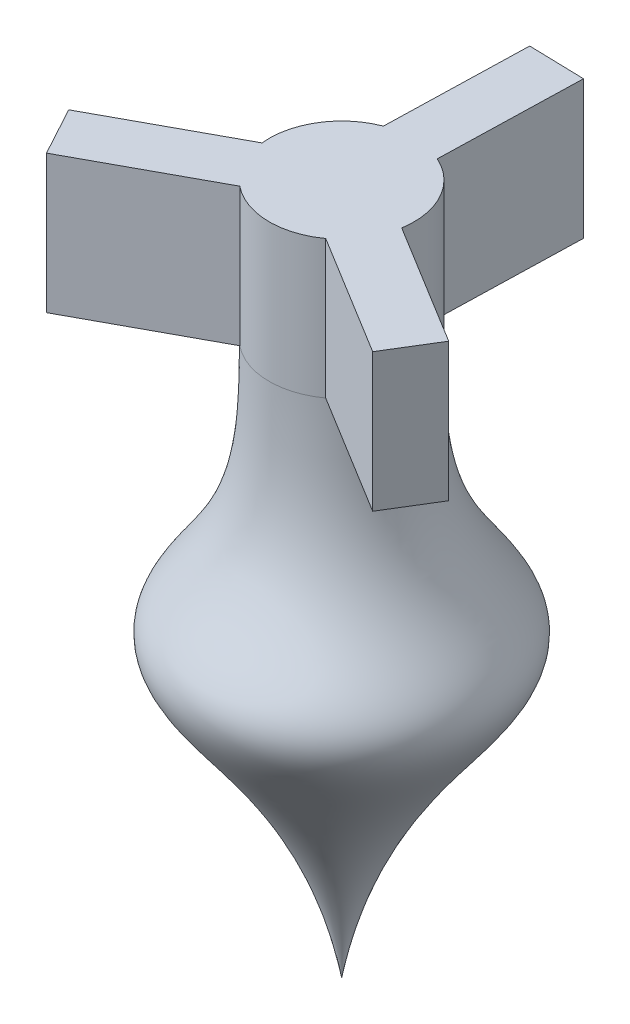
ISO-10303-21;
HEADER;
FILE_DESCRIPTION(('STEP AP214'),'2;1');
FILE_NAME('part.step','',(''),(''),'','','');
FILE_SCHEMA(('AUTOMOTIVE_DESIGN { 1 0 10303 214 1 1 1 1 }'));
ENDSEC;
DATA;
#1=APPLICATION_CONTEXT('core data for automotive mechanical design processes');
#2=APPLICATION_PROTOCOL_DEFINITION('international standard','automotive_design',2000,#1);
#3=PRODUCT_CONTEXT('',#1,'mechanical');
#4=PRODUCT('Part','Part','',(#3));
#5=PRODUCT_RELATED_PRODUCT_CATEGORY('part','',(#4));
#6=PRODUCT_DEFINITION_FORMATION('','',#4);
#7=PRODUCT_DEFINITION_CONTEXT('part definition',#1,'design');
#8=PRODUCT_DEFINITION('design','',#6,#7);
#9=PRODUCT_DEFINITION_SHAPE('','',#8);
#10=(LENGTH_UNIT() NAMED_UNIT(*) SI_UNIT(.MILLI.,.METRE.));
#11=(NAMED_UNIT(*) PLANE_ANGLE_UNIT() SI_UNIT($,.RADIAN.));
#12=(NAMED_UNIT(*) SI_UNIT($,.STERADIAN.) SOLID_ANGLE_UNIT());
#13=UNCERTAINTY_MEASURE_WITH_UNIT(LENGTH_MEASURE(1.E-05),#10,'distance_accuracy_value','');
#14=(GEOMETRIC_REPRESENTATION_CONTEXT(3) GLOBAL_UNCERTAINTY_ASSIGNED_CONTEXT((#13)) GLOBAL_UNIT_ASSIGNED_CONTEXT((#10,
#11,#12)) REPRESENTATION_CONTEXT('',''));
#15=CARTESIAN_POINT('',(0.,0.,0.));
#16=DIRECTION('',(0.,0.,1.));
#17=DIRECTION('',(1.,0.,0.));
#18=AXIS2_PLACEMENT_3D('',#15,#16,#17);
#19=CARTESIAN_POINT('',(0.,16.8298057249515,0.));
#20=DIRECTION('',(0.,-1.,0.));
#21=DIRECTION('',(0.,0.,-1.));
#22=AXIS2_PLACEMENT_3D('',#19,#20,#21);
#23=CYLINDRICAL_SURFACE('',#22,13.0970940867519);
#24=CARTESIAN_POINT('',(0.,41.8298057249515,0.));
#25=DIRECTION('',(0.,-1.,0.));
#26=DIRECTION('',(0.,0.,-1.));
#27=AXIS2_PLACEMENT_3D('',#24,#25,#26);
#28=CIRCLE('',#27,13.0970940867519);
#29=CARTESIAN_POINT('',(5.31910648056195,41.8298057249515,-11.9683323719587));
#30=VERTEX_POINT('',#29);
#31=CARTESIAN_POINT('',(12.9331221328938,41.8298057249515,2.06596839590619));
#32=VERTEX_POINT('',#31);
#33=EDGE_CURVE('E11',#30,#32,#28,.T.);
#34=ORIENTED_EDGE('',*,*,#33,.T.);
#35=DIRECTION('',(0.,-1.,0.));
#36=VECTOR('',#35,1.);
#37=CARTESIAN_POINT('',(12.9331221328938,41.8298057249515,2.06596839590619));
#38=LINE('',#37,#36);
#39=CARTESIAN_POINT('',(12.9331221328938,16.8298057249515,2.06596839590619));
#40=VERTEX_POINT('',#39);
#41=EDGE_CURVE('E74',#32,#40,#38,.T.);
#42=ORIENTED_EDGE('',*,*,#41,.T.);
#43=CARTESIAN_POINT('',(0.,16.8298057249515,0.));
#44=DIRECTION('',(0.,-1.,0.));
#45=DIRECTION('',(0.,0.,-1.));
#46=AXIS2_PLACEMENT_3D('',#43,#44,#45);
#47=CIRCLE('',#46,13.0970940867519);
#48=CARTESIAN_POINT('',(5.31910648056195,16.8298057249515,-11.9683323719587));
#49=VERTEX_POINT('',#48);
#50=EDGE_CURVE('E269',#49,#40,#47,.T.);
#51=ORIENTED_EDGE('',*,*,#50,.F.);
#52=DIRECTION('',(0.,-1.,0.));
#53=VECTOR('',#52,1.);
#54=CARTESIAN_POINT('',(5.31910648056195,41.8298057249515,-11.9683323719587));
#55=LINE('',#54,#53);
#56=EDGE_CURVE('E254',#30,#49,#55,.T.);
#57=ORIENTED_EDGE('',*,*,#56,.F.);
#58=EDGE_LOOP('',(#34,#42,#51,#57));
#59=FACE_BOUND('',#58,.T.);
#60=ADVANCED_FACE('F49',(#59),#23,.T.);
#61=CARTESIAN_POINT('',(7.70532663477087,16.8298057249515,10.5906475235805));
#62=VERTEX_POINT('',#61);
#63=CARTESIAN_POINT('',(-8.25574218071735,16.8298057249515,10.1674281193798));
#64=VERTEX_POINT('',#63);
#65=EDGE_CURVE('E67',#62,#64,#47,.T.);
#66=ORIENTED_EDGE('',*,*,#65,.F.);
#67=DIRECTION('',(0.,-1.,0.));
#68=VECTOR('',#67,1.);
#69=CARTESIAN_POINT('',(7.70532663477087,41.8298057249515,10.5906475235805));
#70=LINE('',#69,#68);
#71=CARTESIAN_POINT('',(7.70532663477087,41.8298057249515,10.5906475235805));
#72=VERTEX_POINT('',#71);
#73=EDGE_CURVE('E303',#72,#62,#70,.T.);
#74=ORIENTED_EDGE('',*,*,#73,.F.);
#75=CARTESIAN_POINT('',(-8.25574218071734,41.8298057249515,10.1674281193798));
#76=VERTEX_POINT('',#75);
#77=EDGE_CURVE('E59',#72,#76,#28,.T.);
#78=ORIENTED_EDGE('',*,*,#77,.T.);
#79=DIRECTION('',(0.,-1.,0.));
#80=VECTOR('',#79,1.);
#81=CARTESIAN_POINT('',(-8.25574218071734,41.8298057249515,10.1674281193798));
#82=LINE('',#81,#80);
#83=EDGE_CURVE('E173',#76,#64,#82,.T.);
#84=ORIENTED_EDGE('',*,*,#83,.T.);
#85=EDGE_LOOP('',(#66,#74,#78,#84));
#86=FACE_BOUND('',#85,.T.);
#87=ADVANCED_FACE('F314',(#86),#23,.T.);
#88=CARTESIAN_POINT('',(-13.0244331153329,16.8298057249515,1.37768484837832));
#89=VERTEX_POINT('',#88);
#90=CARTESIAN_POINT('',(-4.67737995217641,16.8298057249515,-12.2333965152859));
#91=VERTEX_POINT('',#90);
#92=EDGE_CURVE('E265',#89,#91,#47,.T.);
#93=ORIENTED_EDGE('',*,*,#92,.F.);
#94=DIRECTION('',(0.,-1.,0.));
#95=VECTOR('',#94,1.);
#96=CARTESIAN_POINT('',(-13.0244331153329,41.8298057249515,1.37768484837832));
#97=LINE('',#96,#95);
#98=CARTESIAN_POINT('',(-13.0244331153329,41.8298057249515,1.37768484837832));
#99=VERTEX_POINT('',#98);
#100=EDGE_CURVE('E177',#99,#89,#97,.T.);
#101=ORIENTED_EDGE('',*,*,#100,.F.);
#102=CARTESIAN_POINT('',(-4.67737995217641,41.8298057249515,-12.2333965152859));
#103=VERTEX_POINT('',#102);
#104=EDGE_CURVE('E60',#99,#103,#28,.T.);
#105=ORIENTED_EDGE('',*,*,#104,.T.);
#106=DIRECTION('',(0.,-1.,0.));
#107=VECTOR('',#106,1.);
#108=CARTESIAN_POINT('',(-4.67737995217641,41.8298057249515,-12.2333965152859));
#109=LINE('',#108,#107);
#110=EDGE_CURVE('E258',#103,#91,#109,.T.);
#111=ORIENTED_EDGE('',*,*,#110,.T.);
#112=EDGE_LOOP('',(#93,#101,#105,#111));
#113=FACE_BOUND('',#112,.T.);
#114=ADVANCED_FACE('F290',(#113),#23,.T.);
#115=CARTESIAN_POINT('',(0.,-83.1701942750485,0.));
#116=CARTESIAN_POINT('',(-9.19623318599994,-29.3835447194182,0.));
#117=CARTESIAN_POINT('',(-56.3121040622363,-30.1178180317751,0.));
#118=CARTESIAN_POINT('',(-14.4585252578913,-24.733147074491,0.));
#119=CARTESIAN_POINT('',(-13.0970940867519,-14.0081970464951,0.));
#120=CARTESIAN_POINT('',(-13.0970940867519,16.8298057249515,0.));
#121=B_SPLINE_CURVE_WITH_KNOTS('',5,(#115,#116,#117,#118,#119,#120),.UNSPECIFIED.,.F.,.F.,(6,6),
(0.,1.),.UNSPECIFIED.);
#122=CARTESIAN_POINT('',(0.,16.8298057249515,0.));
#123=DIRECTION('',(0.,-1.,0.));
#124=AXIS1_PLACEMENT('',#122,#123);
#125=SURFACE_OF_REVOLUTION('',#121,#124);
#126=ORIENTED_EDGE('',*,*,#50,.T.);
#127=CARTESIAN_POINT('',(0.,16.8298057249515,0.));
#128=DIRECTION('',(0.,-1.,0.));
#129=DIRECTION('',(0.,0.,1.));
#130=AXIS2_PLACEMENT_3D('',#127,#128,#129);
#131=CIRCLE('',#130,13.0970940867519);
#132=EDGE_CURVE('E171',#40,#62,#131,.T.);
#133=ORIENTED_EDGE('',*,*,#132,.T.);
#134=ORIENTED_EDGE('',*,*,#65,.T.);
#135=CARTESIAN_POINT('',(0.,16.8298057249515,0.));
#136=DIRECTION('',(0.,-1.,0.));
#137=DIRECTION('',(0.,0.,1.));
#138=AXIS2_PLACEMENT_3D('',#135,#136,#137);
#139=CIRCLE('',#138,13.0970940867519);
#140=EDGE_CURVE('E208',#64,#89,#139,.T.);
#141=ORIENTED_EDGE('',*,*,#140,.T.);
#142=ORIENTED_EDGE('',*,*,#92,.T.);
#143=CARTESIAN_POINT('',(0.,16.8298057249515,0.));
#144=DIRECTION('',(0.,-1.,0.));
#145=DIRECTION('',(0.,0.,1.));
#146=AXIS2_PLACEMENT_3D('',#143,#144,#145);
#147=CIRCLE('',#146,13.0970940867519);
#148=EDGE_CURVE('E245',#91,#49,#147,.T.);
#149=ORIENTED_EDGE('',*,*,#148,.T.);
#150=EDGE_LOOP('',(#126,#133,#134,#141,#142,#149));
#151=FACE_BOUND('',#150,.T.);
#152=CARTESIAN_POINT('',(0.,-83.1701942750485,0.));
#153=VERTEX_POINT('',#152);
#154=VERTEX_LOOP('',#153);
#155=FACE_BOUND('',#154,.T.);
#156=ADVANCED_FACE('F51',(#151,#155),#125,.F.);
#157=CARTESIAN_POINT('',(0.,41.8298057249515,0.));
#158=DIRECTION('',(0.,1.,0.));
#159=DIRECTION('',(0.,0.,1.));
#160=AXIS2_PLACEMENT_3D('',#157,#158,#159);
#161=PLANE('',#160);
#162=ORIENTED_EDGE('',*,*,#33,.F.);
#163=DIRECTION('',(0.0265064143327188,0.,-0.999648643273837));
#164=VECTOR('',#163,1.);
#165=CARTESIAN_POINT('',(6.00272687611384,41.8298057249515,-37.7500240164686));
#166=LINE('',#165,#164);
#167=CARTESIAN_POINT('',(6.00272687611384,41.8298057249515,-37.7500240164686));
#168=VERTEX_POINT('',#167);
#169=EDGE_CURVE('E234',#30,#168,#166,.T.);
#170=ORIENTED_EDGE('',*,*,#169,.T.);
#171=DIRECTION('',(-0.999648643273837,0.,-0.0265064143327186));
#172=VECTOR('',#171,1.);
#173=CARTESIAN_POINT('',(6.00272687611384,41.8298057249515,-37.7500240164686));
#174=LINE('',#173,#172);
#175=CARTESIAN_POINT('',(-3.99375955662452,41.8298057249515,-38.0150881597958));
#176=VERTEX_POINT('',#175);
#177=EDGE_CURVE('E225',#168,#176,#174,.T.);
#178=ORIENTED_EDGE('',*,*,#177,.T.);
#179=DIRECTION('',(-0.0265064143327189,0.,0.999648643273837));
#180=VECTOR('',#179,1.);
#181=CARTESIAN_POINT('',(-3.99375955662452,41.8298057249515,-38.0150881597958));
#182=LINE('',#181,#180);
#183=EDGE_CURVE('E229',#176,#103,#182,.T.);
#184=ORIENTED_EDGE('',*,*,#183,.T.);
#185=ORIENTED_EDGE('',*,*,#104,.F.);
#186=DIRECTION('',(-0.878974327100148,0.,0.476869093461552));
#187=VECTOR('',#186,1.);
#188=CARTESIAN_POINT('',(-35.6938432297913,41.8298057249515,13.6764980415403));
#189=LINE('',#188,#187);
#190=CARTESIAN_POINT('',(-35.6938432297913,41.8298057249515,13.6764980415403));
#191=VERTEX_POINT('',#190);
#192=EDGE_CURVE('E219',#99,#191,#189,.T.);
#193=ORIENTED_EDGE('',*,*,#192,.T.);
#194=DIRECTION('',(0.476869093461552,0.,0.878974327100148));
#195=VECTOR('',#194,1.);
#196=CARTESIAN_POINT('',(-30.9251522951758,41.8298057249515,22.4662413125417));
#197=LINE('',#196,#195);
#198=CARTESIAN_POINT('',(-30.9251522951758,41.8298057249515,22.4662413125417));
#199=VERTEX_POINT('',#198);
#200=EDGE_CURVE('E200',#191,#199,#197,.T.);
#201=ORIENTED_EDGE('',*,*,#200,.T.);
#202=DIRECTION('',(0.878974327100148,0.,-0.476869093461552));
#203=VECTOR('',#202,1.);
#204=CARTESIAN_POINT('',(-30.9251522951758,41.8298057249515,22.4662413125417));
#205=LINE('',#204,#203);
#206=EDGE_CURVE('E205',#199,#76,#205,.T.);
#207=ORIENTED_EDGE('',*,*,#206,.T.);
#208=ORIENTED_EDGE('',*,*,#77,.F.);
#209=DIRECTION('',(0.852467912767429,0.,0.522779549812293));
#210=VECTOR('',#209,1.);
#211=CARTESIAN_POINT('',(29.6911163536774,41.8298057249515,24.0735259749286));
#212=LINE('',#211,#210);
#213=CARTESIAN_POINT('',(29.6911163536774,41.8298057249515,24.0735259749286));
#214=VERTEX_POINT('',#213);
#215=EDGE_CURVE('E184',#72,#214,#212,.T.);
#216=ORIENTED_EDGE('',*,*,#215,.T.);
#217=DIRECTION('',(0.522779549812293,0.,-0.852467912767429));
#218=VECTOR('',#217,1.);
#219=CARTESIAN_POINT('',(29.6911163536774,41.8298057249515,24.0735259749286));
#220=LINE('',#219,#218);
#221=CARTESIAN_POINT('',(34.9189118518004,41.8298057249515,15.5488468472543));
#222=VERTEX_POINT('',#221);
#223=EDGE_CURVE('E167',#214,#222,#220,.T.);
#224=ORIENTED_EDGE('',*,*,#223,.T.);
#225=DIRECTION('',(-0.852467912767429,0.,-0.522779549812293));
#226=VECTOR('',#225,1.);
#227=CARTESIAN_POINT('',(34.9189118518004,41.8298057249515,15.5488468472543));
#228=LINE('',#227,#226);
#229=EDGE_CURVE('E159',#222,#32,#228,.T.);
#230=ORIENTED_EDGE('',*,*,#229,.T.);
#231=EDGE_LOOP('',(#162,#170,#178,#184,#185,#193,#201,#207,#208,#216,#224,#230));
#232=FACE_BOUND('',#231,.T.);
#233=ADVANCED_FACE('F294',(#232),#161,.T.);
#234=CARTESIAN_POINT('',(6.00272687611384,41.8298057249515,-37.7500240164686));
#235=DIRECTION('',(-0.0265064143327186,0.,0.999648643273837));
#236=DIRECTION('',(0.999648643273837,0.,0.0265064143327186));
#237=AXIS2_PLACEMENT_3D('',#234,#235,#236);
#238=PLANE('',#237);
#239=DIRECTION('',(-0.999648643273837,0.,-0.0265064143327186));
#240=VECTOR('',#239,1.);
#241=CARTESIAN_POINT('',(6.00272687611384,16.8298057249515,-37.7500240164686));
#242=LINE('',#241,#240);
#243=CARTESIAN_POINT('',(6.00272687611384,16.8298057249515,-37.7500240164686));
#244=VERTEX_POINT('',#243);
#245=CARTESIAN_POINT('',(-3.99375955662452,16.8298057249515,-38.0150881597958));
#246=VERTEX_POINT('',#245);
#247=EDGE_CURVE('E216',#244,#246,#242,.T.);
#248=ORIENTED_EDGE('',*,*,#247,.T.);
#249=DIRECTION('',(0.,-1.,0.));
#250=VECTOR('',#249,1.);
#251=CARTESIAN_POINT('',(-3.99375955662452,41.8298057249515,-38.0150881597958));
#252=LINE('',#251,#250);
#253=EDGE_CURVE('E262',#176,#246,#252,.T.);
#254=ORIENTED_EDGE('',*,*,#253,.F.);
#255=ORIENTED_EDGE('',*,*,#177,.F.);
#256=DIRECTION('',(0.,-1.,0.));
#257=VECTOR('',#256,1.);
#258=CARTESIAN_POINT('',(6.00272687611384,41.8298057249515,-37.7500240164686));
#259=LINE('',#258,#257);
#260=EDGE_CURVE('E237',#168,#244,#259,.T.);
#261=ORIENTED_EDGE('',*,*,#260,.T.);
#262=EDGE_LOOP('',(#248,#254,#255,#261));
#263=FACE_BOUND('',#262,.T.);
#264=ADVANCED_FACE('F298',(#263),#238,.F.);
#265=CARTESIAN_POINT('',(-3.99375955662452,41.8298057249515,-38.0150881597958));
#266=DIRECTION('',(0.999648643273837,0.,0.0265064143327189));
#267=DIRECTION('',(0.0265064143327189,0.,-0.999648643273837));
#268=AXIS2_PLACEMENT_3D('',#265,#266,#267);
#269=PLANE('',#268);
#270=DIRECTION('',(-0.0265064143327189,0.,0.999648643273837));
#271=VECTOR('',#270,1.);
#272=CARTESIAN_POINT('',(-3.99375955662452,16.8298057249515,-38.0150881597958));
#273=LINE('',#272,#271);
#274=EDGE_CURVE('E241',#246,#91,#273,.T.);
#275=ORIENTED_EDGE('',*,*,#274,.T.);
#276=ORIENTED_EDGE('',*,*,#110,.F.);
#277=ORIENTED_EDGE('',*,*,#183,.F.);
#278=ORIENTED_EDGE('',*,*,#253,.T.);
#279=EDGE_LOOP('',(#275,#276,#277,#278));
#280=FACE_BOUND('',#279,.T.);
#281=ADVANCED_FACE('F285',(#280),#269,.F.);
#282=CARTESIAN_POINT('',(6.00272687611384,41.8298057249515,-37.7500240164686));
#283=DIRECTION('',(-0.999648643273837,0.,-0.0265064143327188));
#284=DIRECTION('',(-0.0265064143327188,0.,0.999648643273837));
#285=AXIS2_PLACEMENT_3D('',#282,#283,#284);
#286=PLANE('',#285);
#287=DIRECTION('',(0.0265064143327188,0.,-0.999648643273837));
#288=VECTOR('',#287,1.);
#289=CARTESIAN_POINT('',(6.00272687611384,16.8298057249515,-37.7500240164686));
#290=LINE('',#289,#288);
#291=EDGE_CURVE('E230',#49,#244,#290,.T.);
#292=ORIENTED_EDGE('',*,*,#291,.T.);
#293=ORIENTED_EDGE('',*,*,#260,.F.);
#294=ORIENTED_EDGE('',*,*,#169,.F.);
#295=ORIENTED_EDGE('',*,*,#56,.T.);
#296=EDGE_LOOP('',(#292,#293,#294,#295));
#297=FACE_BOUND('',#296,.T.);
#298=ADVANCED_FACE('F300',(#297),#286,.F.);
#299=CARTESIAN_POINT('',(0.,16.8298057249515,0.));
#300=DIRECTION('',(0.,1.,0.));
#301=DIRECTION('',(0.,0.,1.));
#302=AXIS2_PLACEMENT_3D('',#299,#300,#301);
#303=PLANE('',#302);
#304=ORIENTED_EDGE('',*,*,#247,.F.);
#305=ORIENTED_EDGE('',*,*,#291,.F.);
#306=ORIENTED_EDGE('',*,*,#148,.F.);
#307=ORIENTED_EDGE('',*,*,#274,.F.);
#308=EDGE_LOOP('',(#304,#305,#306,#307));
#309=FACE_BOUND('',#308,.T.);
#310=ADVANCED_FACE('F289',(#309),#303,.F.);
#311=CARTESIAN_POINT('',(-30.9251522951758,41.8298057249515,22.4662413125417));
#312=DIRECTION('',(-0.476869093461552,0.,-0.878974327100148));
#313=DIRECTION('',(-0.878974327100148,0.,0.476869093461552));
#314=AXIS2_PLACEMENT_3D('',#311,#312,#313);
#315=PLANE('',#314);
#316=DIRECTION('',(0.878974327100148,0.,-0.476869093461552));
#317=VECTOR('',#316,1.);
#318=CARTESIAN_POINT('',(-30.9251522951758,16.8298057249515,22.4662413125417));
#319=LINE('',#318,#317);
#320=CARTESIAN_POINT('',(-30.9251522951758,16.8298057249515,22.4662413125417));
#321=VERTEX_POINT('',#320);
#322=EDGE_CURVE('E212',#321,#64,#319,.T.);
#323=ORIENTED_EDGE('',*,*,#322,.T.);
#324=ORIENTED_EDGE('',*,*,#83,.F.);
#325=ORIENTED_EDGE('',*,*,#206,.F.);
#326=DIRECTION('',(0.,-1.,0.));
#327=VECTOR('',#326,1.);
#328=CARTESIAN_POINT('',(-30.9251522951758,41.8298057249515,22.4662413125417));
#329=LINE('',#328,#327);
#330=EDGE_CURVE('E196',#199,#321,#329,.T.);
#331=ORIENTED_EDGE('',*,*,#330,.T.);
#332=EDGE_LOOP('',(#323,#324,#325,#331));
#333=FACE_BOUND('',#332,.T.);
#334=ADVANCED_FACE('F321',(#333),#315,.F.);
#335=CARTESIAN_POINT('',(-35.6938432297913,41.8298057249515,13.6764980415403));
#336=DIRECTION('',(0.476869093461552,0.,0.878974327100148));
#337=DIRECTION('',(0.878974327100148,0.,-0.476869093461552));
#338=AXIS2_PLACEMENT_3D('',#335,#336,#337);
#339=PLANE('',#338);
#340=DIRECTION('',(-0.878974327100148,0.,0.476869093461552));
#341=VECTOR('',#340,1.);
#342=CARTESIAN_POINT('',(-35.6938432297913,16.8298057249515,13.6764980415403));
#343=LINE('',#342,#341);
#344=CARTESIAN_POINT('',(-35.6938432297913,16.8298057249515,13.6764980415403));
#345=VERTEX_POINT('',#344);
#346=EDGE_CURVE('E204',#89,#345,#343,.T.);
#347=ORIENTED_EDGE('',*,*,#346,.T.);
#348=DIRECTION('',(0.,-1.,0.));
#349=VECTOR('',#348,1.);
#350=CARTESIAN_POINT('',(-35.6938432297913,41.8298057249515,13.6764980415403));
#351=LINE('',#350,#349);
#352=EDGE_CURVE('E192',#191,#345,#351,.T.);
#353=ORIENTED_EDGE('',*,*,#352,.F.);
#354=ORIENTED_EDGE('',*,*,#192,.F.);
#355=ORIENTED_EDGE('',*,*,#100,.T.);
#356=EDGE_LOOP('',(#347,#353,#354,#355));
#357=FACE_BOUND('',#356,.T.);
#358=ADVANCED_FACE('F329',(#357),#339,.F.);
#359=CARTESIAN_POINT('',(-30.9251522951758,41.8298057249515,22.4662413125417));
#360=DIRECTION('',(0.878974327100148,0.,-0.476869093461552));
#361=DIRECTION('',(-0.476869093461552,0.,-0.878974327100148));
#362=AXIS2_PLACEMENT_3D('',#359,#360,#361);
#363=PLANE('',#362);
#364=DIRECTION('',(0.476869093461552,0.,0.878974327100148));
#365=VECTOR('',#364,1.);
#366=CARTESIAN_POINT('',(-30.9251522951758,16.8298057249515,22.4662413125417));
#367=LINE('',#366,#365);
#368=EDGE_CURVE('E201',#345,#321,#367,.T.);
#369=ORIENTED_EDGE('',*,*,#368,.T.);
#370=ORIENTED_EDGE('',*,*,#330,.F.);
#371=ORIENTED_EDGE('',*,*,#200,.F.);
#372=ORIENTED_EDGE('',*,*,#352,.T.);
#373=EDGE_LOOP('',(#369,#370,#371,#372));
#374=FACE_BOUND('',#373,.T.);
#375=ADVANCED_FACE('F331',(#374),#363,.F.);
#376=CARTESIAN_POINT('',(0.,16.8298057249515,0.));
#377=DIRECTION('',(0.,1.,0.));
#378=DIRECTION('',(0.,0.,1.));
#379=AXIS2_PLACEMENT_3D('',#376,#377,#378);
#380=PLANE('',#379);
#381=ORIENTED_EDGE('',*,*,#322,.F.);
#382=ORIENTED_EDGE('',*,*,#368,.F.);
#383=ORIENTED_EDGE('',*,*,#346,.F.);
#384=ORIENTED_EDGE('',*,*,#140,.F.);
#385=EDGE_LOOP('',(#381,#382,#383,#384));
#386=FACE_BOUND('',#385,.T.);
#387=ADVANCED_FACE('F325',(#386),#380,.F.);
#388=CARTESIAN_POINT('',(34.9189118518004,41.8298057249515,15.5488468472543));
#389=DIRECTION('',(-0.522779549812293,0.,0.852467912767429));
#390=DIRECTION('',(0.852467912767429,0.,0.522779549812293));
#391=AXIS2_PLACEMENT_3D('',#388,#389,#390);
#392=PLANE('',#391);
#393=DIRECTION('',(-0.852467912767429,0.,-0.522779549812293));
#394=VECTOR('',#393,1.);
#395=CARTESIAN_POINT('',(34.9189118518004,16.8298057249515,15.5488468472543));
#396=LINE('',#395,#394);
#397=CARTESIAN_POINT('',(34.9189118518004,16.8298057249515,15.5488468472543));
#398=VERTEX_POINT('',#397);
#399=EDGE_CURVE('E164',#398,#40,#396,.T.);
#400=ORIENTED_EDGE('',*,*,#399,.T.);
#401=ORIENTED_EDGE('',*,*,#41,.F.);
#402=ORIENTED_EDGE('',*,*,#229,.F.);
#403=DIRECTION('',(0.,-1.,0.));
#404=VECTOR('',#403,1.);
#405=CARTESIAN_POINT('',(34.9189118518004,41.8298057249515,15.5488468472543));
#406=LINE('',#405,#404);
#407=EDGE_CURVE('E150',#222,#398,#406,.T.);
#408=ORIENTED_EDGE('',*,*,#407,.T.);
#409=EDGE_LOOP('',(#400,#401,#402,#408));
#410=FACE_BOUND('',#409,.T.);
#411=ADVANCED_FACE('F163',(#410),#392,.F.);
#412=CARTESIAN_POINT('',(29.6911163536774,41.8298057249515,24.0735259749286));
#413=DIRECTION('',(0.522779549812293,0.,-0.852467912767429));
#414=DIRECTION('',(-0.852467912767429,0.,-0.522779549812293));
#415=AXIS2_PLACEMENT_3D('',#412,#413,#414);
#416=PLANE('',#415);
#417=DIRECTION('',(0.852467912767429,0.,0.522779549812293));
#418=VECTOR('',#417,1.);
#419=CARTESIAN_POINT('',(29.6911163536774,16.8298057249515,24.0735259749286));
#420=LINE('',#419,#418);
#421=CARTESIAN_POINT('',(29.6911163536774,16.8298057249515,24.0735259749286));
#422=VERTEX_POINT('',#421);
#423=EDGE_CURVE('E158',#62,#422,#420,.T.);
#424=ORIENTED_EDGE('',*,*,#423,.T.);
#425=DIRECTION('',(0.,-1.,0.));
#426=VECTOR('',#425,1.);
#427=CARTESIAN_POINT('',(29.6911163536774,41.8298057249515,24.0735259749286));
#428=LINE('',#427,#426);
#429=EDGE_CURVE('E153',#214,#422,#428,.T.);
#430=ORIENTED_EDGE('',*,*,#429,.F.);
#431=ORIENTED_EDGE('',*,*,#215,.F.);
#432=ORIENTED_EDGE('',*,*,#73,.T.);
#433=EDGE_LOOP('',(#424,#430,#431,#432));
#434=FACE_BOUND('',#433,.T.);
#435=ADVANCED_FACE('F312',(#434),#416,.F.);
#436=CARTESIAN_POINT('',(29.6911163536774,41.8298057249515,24.0735259749286));
#437=DIRECTION('',(-0.852467912767429,0.,-0.522779549812293));
#438=DIRECTION('',(-0.522779549812293,0.,0.852467912767429));
#439=AXIS2_PLACEMENT_3D('',#436,#437,#438);
#440=PLANE('',#439);
#441=DIRECTION('',(0.522779549812293,0.,-0.852467912767429));
#442=VECTOR('',#441,1.);
#443=CARTESIAN_POINT('',(29.6911163536774,16.8298057249515,24.0735259749286));
#444=LINE('',#443,#442);
#445=EDGE_CURVE('E146',#422,#398,#444,.T.);
#446=ORIENTED_EDGE('',*,*,#445,.T.);
#447=ORIENTED_EDGE('',*,*,#407,.F.);
#448=ORIENTED_EDGE('',*,*,#223,.F.);
#449=ORIENTED_EDGE('',*,*,#429,.T.);
#450=EDGE_LOOP('',(#446,#447,#448,#449));
#451=FACE_BOUND('',#450,.T.);
#452=ADVANCED_FACE('F148',(#451),#440,.F.);
#453=CARTESIAN_POINT('',(0.,16.8298057249515,0.));
#454=DIRECTION('',(0.,1.,0.));
#455=DIRECTION('',(0.,0.,1.));
#456=AXIS2_PLACEMENT_3D('',#453,#454,#455);
#457=PLANE('',#456);
#458=ORIENTED_EDGE('',*,*,#399,.F.);
#459=ORIENTED_EDGE('',*,*,#445,.F.);
#460=ORIENTED_EDGE('',*,*,#423,.F.);
#461=ORIENTED_EDGE('',*,*,#132,.F.);
#462=EDGE_LOOP('',(#458,#459,#460,#461));
#463=FACE_BOUND('',#462,.T.);
#464=ADVANCED_FACE('F170',(#463),#457,.F.);
#465=CLOSED_SHELL('',(#60,#87,#114,#156,#233,#264,#281,#298,#310,#334,#358,#375,#387,#411,#435,
#452,#464));
#466=MANIFOLD_SOLID_BREP('B2',#465);
#467=ADVANCED_BREP_SHAPE_REPRESENTATION('',(#18,#466),#14);
#468=SHAPE_DEFINITION_REPRESENTATION(#9,#467);
ENDSEC;
END-ISO-10303-21;
